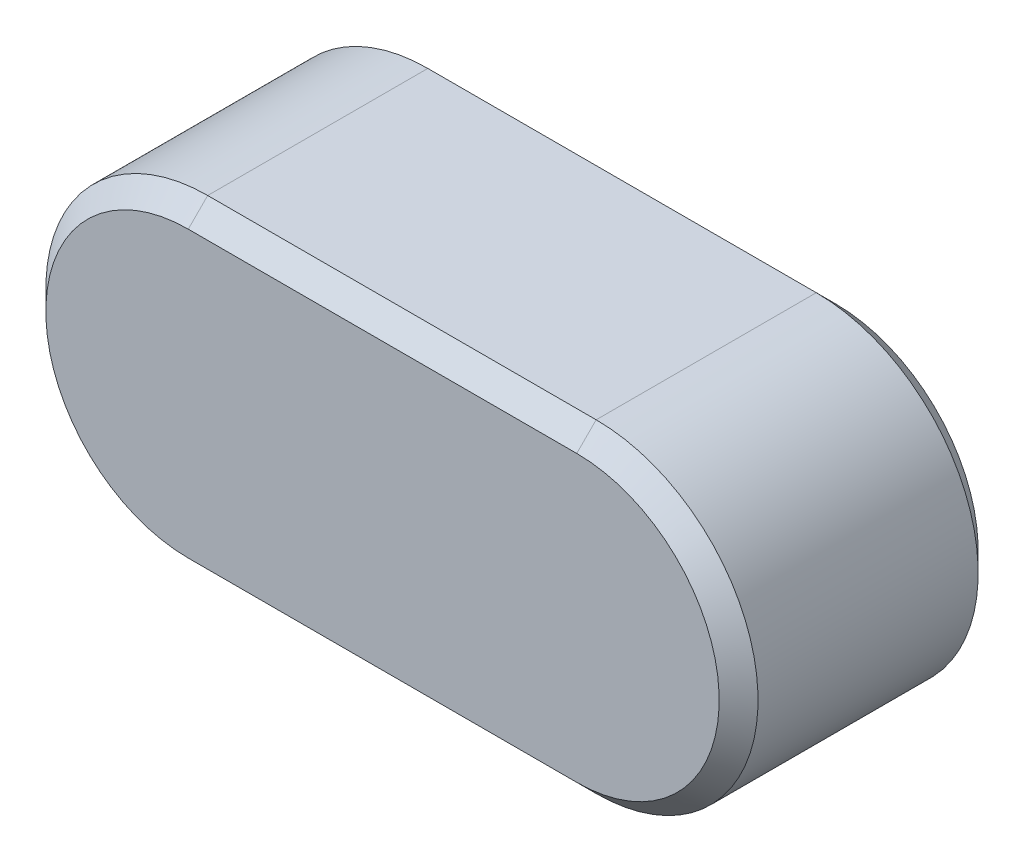
ISO-10303-21;
HEADER;
FILE_DESCRIPTION(('STEP AP214'),'2;1');
FILE_NAME('part.step','',(''),(''),'','','');
FILE_SCHEMA(('AUTOMOTIVE_DESIGN { 1 0 10303 214 1 1 1 1 }'));
ENDSEC;
DATA;
#1=APPLICATION_CONTEXT('core data for automotive mechanical design processes');
#2=APPLICATION_PROTOCOL_DEFINITION('international standard','automotive_design',2000,#1);
#3=PRODUCT_CONTEXT('',#1,'mechanical');
#4=PRODUCT('Part','Part','',(#3));
#5=PRODUCT_RELATED_PRODUCT_CATEGORY('part','',(#4));
#6=PRODUCT_DEFINITION_FORMATION('','',#4);
#7=PRODUCT_DEFINITION_CONTEXT('part definition',#1,'design');
#8=PRODUCT_DEFINITION('design','',#6,#7);
#9=PRODUCT_DEFINITION_SHAPE('','',#8);
#10=(LENGTH_UNIT() NAMED_UNIT(*) SI_UNIT(.MILLI.,.METRE.));
#11=(NAMED_UNIT(*) PLANE_ANGLE_UNIT() SI_UNIT($,.RADIAN.));
#12=(NAMED_UNIT(*) SI_UNIT($,.STERADIAN.) SOLID_ANGLE_UNIT());
#13=UNCERTAINTY_MEASURE_WITH_UNIT(LENGTH_MEASURE(1.E-05),#10,'distance_accuracy_value','');
#14=(GEOMETRIC_REPRESENTATION_CONTEXT(3) GLOBAL_UNCERTAINTY_ASSIGNED_CONTEXT((#13)) GLOBAL_UNIT_ASSIGNED_CONTEXT((#10,
#11,#12)) REPRESENTATION_CONTEXT('',''));
#15=CARTESIAN_POINT('',(0.,0.,0.));
#16=DIRECTION('',(0.,0.,1.));
#17=DIRECTION('',(1.,0.,0.));
#18=AXIS2_PLACEMENT_3D('',#15,#16,#17);
#19=CARTESIAN_POINT('',(-12.,0.,4.));
#20=DIRECTION('',(0.,0.,-1.));
#21=DIRECTION('',(-1.,0.,0.));
#22=AXIS2_PLACEMENT_3D('',#19,#20,#21);
#23=CYLINDRICAL_SURFACE('',#22,5.);
#24=DIRECTION('',(0.,0.,-1.));
#25=VECTOR('',#24,1.);
#26=CARTESIAN_POINT('',(-12.,-5.,4.));
#27=LINE('',#26,#25);
#28=CARTESIAN_POINT('',(-12.,-5.,3.4));
#29=VERTEX_POINT('',#28);
#30=CARTESIAN_POINT('',(-12.,-5.,-3.4));
#31=VERTEX_POINT('',#30);
#32=EDGE_CURVE('E133',#29,#31,#27,.T.);
#33=ORIENTED_EDGE('',*,*,#32,.F.);
#34=CARTESIAN_POINT('',(-12.,0.,3.4));
#35=DIRECTION('',(0.,0.,-1.));
#36=DIRECTION('',(-1.,0.,0.));
#37=AXIS2_PLACEMENT_3D('',#34,#35,#36);
#38=CIRCLE('',#37,5.);
#39=CARTESIAN_POINT('',(-12.,5.,3.4));
#40=VERTEX_POINT('',#39);
#41=EDGE_CURVE('E65',#29,#40,#38,.T.);
#42=ORIENTED_EDGE('',*,*,#41,.T.);
#43=DIRECTION('',(0.,0.,-1.));
#44=VECTOR('',#43,1.);
#45=CARTESIAN_POINT('',(-12.,5.,4.));
#46=LINE('',#45,#44);
#47=CARTESIAN_POINT('',(-12.,5.,-3.4));
#48=VERTEX_POINT('',#47);
#49=EDGE_CURVE('E185',#40,#48,#46,.T.);
#50=ORIENTED_EDGE('',*,*,#49,.T.);
#51=CARTESIAN_POINT('',(-12.,0.,-3.4));
#52=DIRECTION('',(0.,0.,-1.));
#53=DIRECTION('',(-1.,0.,0.));
#54=AXIS2_PLACEMENT_3D('',#51,#52,#53);
#55=CIRCLE('',#54,5.);
#56=EDGE_CURVE('E120',#48,#31,#55,.F.);
#57=ORIENTED_EDGE('',*,*,#56,.T.);
#58=EDGE_LOOP('',(#33,#42,#50,#57));
#59=FACE_BOUND('',#58,.T.);
#60=ADVANCED_FACE('F41',(#59),#23,.T.);
#61=CARTESIAN_POINT('',(0.,-5.,4.));
#62=DIRECTION('',(0.,1.,0.));
#63=DIRECTION('',(-1.,0.,0.));
#64=AXIS2_PLACEMENT_3D('',#61,#62,#63);
#65=PLANE('',#64);
#66=ORIENTED_EDGE('',*,*,#32,.T.);
#67=DIRECTION('',(1.,0.,0.));
#68=VECTOR('',#67,1.);
#69=CARTESIAN_POINT('',(0.,-5.,-3.4));
#70=LINE('',#69,#68);
#71=CARTESIAN_POINT('',(0.,-5.,-3.4));
#72=VERTEX_POINT('',#71);
#73=EDGE_CURVE('E131',#31,#72,#70,.T.);
#74=ORIENTED_EDGE('',*,*,#73,.T.);
#75=DIRECTION('',(0.,0.,-1.));
#76=VECTOR('',#75,1.);
#77=CARTESIAN_POINT('',(0.,-5.,4.));
#78=LINE('',#77,#76);
#79=CARTESIAN_POINT('',(0.,-5.,3.4));
#80=VERTEX_POINT('',#79);
#81=EDGE_CURVE('E113',#80,#72,#78,.T.);
#82=ORIENTED_EDGE('',*,*,#81,.F.);
#83=DIRECTION('',(-1.,0.,0.));
#84=VECTOR('',#83,1.);
#85=CARTESIAN_POINT('',(0.,-5.,3.4));
#86=LINE('',#85,#84);
#87=EDGE_CURVE('E129',#80,#29,#86,.T.);
#88=ORIENTED_EDGE('',*,*,#87,.T.);
#89=EDGE_LOOP('',(#66,#74,#82,#88));
#90=FACE_BOUND('',#89,.T.);
#91=ADVANCED_FACE('F128',(#90),#65,.F.);
#92=CARTESIAN_POINT('',(0.,0.,4.));
#93=DIRECTION('',(0.,0.,-1.));
#94=DIRECTION('',(-1.,0.,0.));
#95=AXIS2_PLACEMENT_3D('',#92,#93,#94);
#96=CYLINDRICAL_SURFACE('',#95,5.);
#97=DIRECTION('',(0.,0.,-1.));
#98=VECTOR('',#97,1.);
#99=CARTESIAN_POINT('',(0.,5.,4.));
#100=LINE('',#99,#98);
#101=CARTESIAN_POINT('',(0.,5.,3.4));
#102=VERTEX_POINT('',#101);
#103=CARTESIAN_POINT('',(0.,5.,-3.4));
#104=VERTEX_POINT('',#103);
#105=EDGE_CURVE('E114',#102,#104,#100,.T.);
#106=ORIENTED_EDGE('',*,*,#105,.F.);
#107=CARTESIAN_POINT('',(0.,0.,3.4));
#108=DIRECTION('',(0.,0.,-1.));
#109=DIRECTION('',(-1.,0.,0.));
#110=AXIS2_PLACEMENT_3D('',#107,#108,#109);
#111=CIRCLE('',#110,5.);
#112=EDGE_CURVE('E110',#102,#80,#111,.T.);
#113=ORIENTED_EDGE('',*,*,#112,.T.);
#114=ORIENTED_EDGE('',*,*,#81,.T.);
#115=CARTESIAN_POINT('',(0.,0.,-3.4));
#116=DIRECTION('',(0.,0.,-1.));
#117=DIRECTION('',(-1.,0.,0.));
#118=AXIS2_PLACEMENT_3D('',#115,#116,#117);
#119=CIRCLE('',#118,5.);
#120=EDGE_CURVE('E121',#72,#104,#119,.F.);
#121=ORIENTED_EDGE('',*,*,#120,.T.);
#122=EDGE_LOOP('',(#106,#113,#114,#121));
#123=FACE_BOUND('',#122,.T.);
#124=ADVANCED_FACE('F112',(#123),#96,.T.);
#125=CARTESIAN_POINT('',(-12.,5.,4.));
#126=DIRECTION('',(0.,-1.,0.));
#127=DIRECTION('',(0.,0.,-1.));
#128=AXIS2_PLACEMENT_3D('',#125,#126,#127);
#129=PLANE('',#128);
#130=ORIENTED_EDGE('',*,*,#49,.F.);
#131=DIRECTION('',(1.,0.,0.));
#132=VECTOR('',#131,1.);
#133=CARTESIAN_POINT('',(-12.,5.,3.4));
#134=LINE('',#133,#132);
#135=EDGE_CURVE('E11',#40,#102,#134,.T.);
#136=ORIENTED_EDGE('',*,*,#135,.T.);
#137=ORIENTED_EDGE('',*,*,#105,.T.);
#138=DIRECTION('',(-1.,0.,0.));
#139=VECTOR('',#138,1.);
#140=CARTESIAN_POINT('',(-12.,5.,-3.4));
#141=LINE('',#140,#139);
#142=EDGE_CURVE('E51',#104,#48,#141,.T.);
#143=ORIENTED_EDGE('',*,*,#142,.T.);
#144=EDGE_LOOP('',(#130,#136,#137,#143));
#145=FACE_BOUND('',#144,.T.);
#146=ADVANCED_FACE('F272',(#145),#129,.F.);
#147=CARTESIAN_POINT('',(-12.,0.,4.));
#148=DIRECTION('',(0.,0.,-1.));
#149=DIRECTION('',(-1.,0.,0.));
#150=AXIS2_PLACEMENT_3D('',#147,#148,#149);
#151=PLANE('',#150);
#152=CARTESIAN_POINT('',(-12.,0.,4.));
#153=DIRECTION('',(0.,0.,-1.));
#154=DIRECTION('',(-1.,0.,0.));
#155=AXIS2_PLACEMENT_3D('',#152,#153,#154);
#156=CIRCLE('',#155,4.4);
#157=CARTESIAN_POINT('',(-12.,4.4,4.));
#158=VERTEX_POINT('',#157);
#159=CARTESIAN_POINT('',(-12.,-4.4,4.));
#160=VERTEX_POINT('',#159);
#161=EDGE_CURVE('E217',#158,#160,#156,.F.);
#162=ORIENTED_EDGE('',*,*,#161,.T.);
#163=DIRECTION('',(1.,0.,0.));
#164=VECTOR('',#163,1.);
#165=CARTESIAN_POINT('',(-12.,-4.4,4.));
#166=LINE('',#165,#164);
#167=CARTESIAN_POINT('',(0.,-4.4,4.));
#168=VERTEX_POINT('',#167);
#169=EDGE_CURVE('E222',#160,#168,#166,.T.);
#170=ORIENTED_EDGE('',*,*,#169,.T.);
#171=CARTESIAN_POINT('',(0.,0.,4.));
#172=DIRECTION('',(0.,0.,-1.));
#173=DIRECTION('',(-1.,0.,0.));
#174=AXIS2_PLACEMENT_3D('',#171,#172,#173);
#175=CIRCLE('',#174,4.4);
#176=CARTESIAN_POINT('',(0.,4.4,4.));
#177=VERTEX_POINT('',#176);
#178=EDGE_CURVE('E145',#168,#177,#175,.F.);
#179=ORIENTED_EDGE('',*,*,#178,.T.);
#180=DIRECTION('',(-1.,0.,0.));
#181=VECTOR('',#180,1.);
#182=CARTESIAN_POINT('',(-12.,4.4,4.));
#183=LINE('',#182,#181);
#184=EDGE_CURVE('E214',#177,#158,#183,.T.);
#185=ORIENTED_EDGE('',*,*,#184,.T.);
#186=EDGE_LOOP('',(#162,#170,#179,#185));
#187=FACE_BOUND('',#186,.T.);
#188=ADVANCED_FACE('F275',(#187),#151,.F.);
#189=CARTESIAN_POINT('',(-12.,0.,-4.));
#190=DIRECTION('',(0.,0.,-1.));
#191=DIRECTION('',(-1.,0.,0.));
#192=AXIS2_PLACEMENT_3D('',#189,#190,#191);
#193=PLANE('',#192);
#194=CARTESIAN_POINT('',(0.,0.,-4.));
#195=DIRECTION('',(0.,0.,-1.));
#196=DIRECTION('',(-1.,0.,0.));
#197=AXIS2_PLACEMENT_3D('',#194,#195,#196);
#198=CIRCLE('',#197,4.4);
#199=CARTESIAN_POINT('',(0.,4.4,-4.));
#200=VERTEX_POINT('',#199);
#201=CARTESIAN_POINT('',(0.,-4.4,-4.));
#202=VERTEX_POINT('',#201);
#203=EDGE_CURVE('E207',#200,#202,#198,.T.);
#204=ORIENTED_EDGE('',*,*,#203,.T.);
#205=DIRECTION('',(-1.,0.,0.));
#206=VECTOR('',#205,1.);
#207=CARTESIAN_POINT('',(-12.,-4.4,-4.));
#208=LINE('',#207,#206);
#209=CARTESIAN_POINT('',(-12.,-4.4,-4.));
#210=VERTEX_POINT('',#209);
#211=EDGE_CURVE('E210',#202,#210,#208,.T.);
#212=ORIENTED_EDGE('',*,*,#211,.T.);
#213=CARTESIAN_POINT('',(-12.,0.,-4.));
#214=DIRECTION('',(0.,0.,-1.));
#215=DIRECTION('',(-1.,0.,0.));
#216=AXIS2_PLACEMENT_3D('',#213,#214,#215);
#217=CIRCLE('',#216,4.4);
#218=CARTESIAN_POINT('',(-12.,4.4,-4.));
#219=VERTEX_POINT('',#218);
#220=EDGE_CURVE('E204',#210,#219,#217,.T.);
#221=ORIENTED_EDGE('',*,*,#220,.T.);
#222=DIRECTION('',(1.,0.,0.));
#223=VECTOR('',#222,1.);
#224=CARTESIAN_POINT('',(0.,4.4,-4.));
#225=LINE('',#224,#223);
#226=EDGE_CURVE('E201',#219,#200,#225,.T.);
#227=ORIENTED_EDGE('',*,*,#226,.T.);
#228=EDGE_LOOP('',(#204,#212,#221,#227));
#229=FACE_BOUND('',#228,.T.);
#230=ADVANCED_FACE('F276',(#229),#193,.T.);
#231=CARTESIAN_POINT('',(-12.,5.,-3.4));
#232=DIRECTION('',(0.,0.707106781186547,-0.707106781186547));
#233=DIRECTION('',(0.,0.707106781186548,0.707106781186548));
#234=AXIS2_PLACEMENT_3D('',#231,#232,#233);
#235=PLANE('',#234);
#236=DIRECTION('',(0.,0.707106781186547,0.707106781186547));
#237=VECTOR('',#236,1.);
#238=CARTESIAN_POINT('',(0.,4.4,-4.));
#239=LINE('',#238,#237);
#240=EDGE_CURVE('E174',#200,#104,#239,.T.);
#241=ORIENTED_EDGE('',*,*,#240,.F.);
#242=ORIENTED_EDGE('',*,*,#226,.F.);
#243=DIRECTION('',(0.,-0.707106781186547,-0.707106781186547));
#244=VECTOR('',#243,1.);
#245=CARTESIAN_POINT('',(-12.,5.,-3.4));
#246=LINE('',#245,#244);
#247=EDGE_CURVE('E154',#48,#219,#246,.T.);
#248=ORIENTED_EDGE('',*,*,#247,.F.);
#249=ORIENTED_EDGE('',*,*,#142,.F.);
#250=EDGE_LOOP('',(#241,#242,#248,#249));
#251=FACE_BOUND('',#250,.T.);
#252=ADVANCED_FACE('F279',(#251),#235,.T.);
#253=CARTESIAN_POINT('',(-12.,0.,-3.4));
#254=DIRECTION('',(0.,0.,1.));
#255=DIRECTION('',(1.,0.,0.));
#256=AXIS2_PLACEMENT_3D('',#253,#254,#255);
#257=CONICAL_SURFACE('',#256,5.,0.785398163397448);
#258=ORIENTED_EDGE('',*,*,#247,.T.);
#259=ORIENTED_EDGE('',*,*,#220,.F.);
#260=DIRECTION('',(0.,0.707106781186547,-0.707106781186547));
#261=VECTOR('',#260,1.);
#262=CARTESIAN_POINT('',(-12.,-5.,-3.4));
#263=LINE('',#262,#261);
#264=EDGE_CURVE('E166',#31,#210,#263,.T.);
#265=ORIENTED_EDGE('',*,*,#264,.F.);
#266=ORIENTED_EDGE('',*,*,#56,.F.);
#267=EDGE_LOOP('',(#258,#259,#265,#266));
#268=FACE_BOUND('',#267,.T.);
#269=ADVANCED_FACE('F251',(#268),#257,.T.);
#270=CARTESIAN_POINT('',(0.,0.,-3.4));
#271=DIRECTION('',(0.,0.,1.));
#272=DIRECTION('',(1.,0.,0.));
#273=AXIS2_PLACEMENT_3D('',#270,#271,#272);
#274=CONICAL_SURFACE('',#273,5.,0.785398163397448);
#275=ORIENTED_EDGE('',*,*,#240,.T.);
#276=ORIENTED_EDGE('',*,*,#120,.F.);
#277=DIRECTION('',(0.,-0.707106781186547,0.707106781186547));
#278=VECTOR('',#277,1.);
#279=CARTESIAN_POINT('',(0.,-4.4,-4.));
#280=LINE('',#279,#278);
#281=EDGE_CURVE('E160',#202,#72,#280,.T.);
#282=ORIENTED_EDGE('',*,*,#281,.F.);
#283=ORIENTED_EDGE('',*,*,#203,.F.);
#284=EDGE_LOOP('',(#275,#276,#282,#283));
#285=FACE_BOUND('',#284,.T.);
#286=ADVANCED_FACE('F254',(#285),#274,.T.);
#287=CARTESIAN_POINT('',(0.,-5.,-3.4));
#288=DIRECTION('',(0.,-0.707106781186547,-0.707106781186547));
#289=DIRECTION('',(0.,0.707106781186548,-0.707106781186548));
#290=AXIS2_PLACEMENT_3D('',#287,#288,#289);
#291=PLANE('',#290);
#292=ORIENTED_EDGE('',*,*,#264,.T.);
#293=ORIENTED_EDGE('',*,*,#211,.F.);
#294=ORIENTED_EDGE('',*,*,#281,.T.);
#295=ORIENTED_EDGE('',*,*,#73,.F.);
#296=EDGE_LOOP('',(#292,#293,#294,#295));
#297=FACE_BOUND('',#296,.T.);
#298=ADVANCED_FACE('F252',(#297),#291,.T.);
#299=CARTESIAN_POINT('',(-12.,4.4,4.));
#300=DIRECTION('',(0.,-0.707106781186547,-0.707106781186547));
#301=DIRECTION('',(0.,0.707106781186548,-0.707106781186548));
#302=AXIS2_PLACEMENT_3D('',#299,#300,#301);
#303=PLANE('',#302);
#304=DIRECTION('',(0.,-0.707106781186547,0.707106781186547));
#305=VECTOR('',#304,1.);
#306=CARTESIAN_POINT('',(0.,5.,3.4));
#307=LINE('',#306,#305);
#308=EDGE_CURVE('E151',#102,#177,#307,.T.);
#309=ORIENTED_EDGE('',*,*,#308,.F.);
#310=ORIENTED_EDGE('',*,*,#135,.F.);
#311=DIRECTION('',(0.,0.707106781186547,-0.707106781186547));
#312=VECTOR('',#311,1.);
#313=CARTESIAN_POINT('',(-12.,4.4,4.));
#314=LINE('',#313,#312);
#315=EDGE_CURVE('E45',#158,#40,#314,.T.);
#316=ORIENTED_EDGE('',*,*,#315,.F.);
#317=ORIENTED_EDGE('',*,*,#184,.F.);
#318=EDGE_LOOP('',(#309,#310,#316,#317));
#319=FACE_BOUND('',#318,.T.);
#320=ADVANCED_FACE('F43',(#319),#303,.F.);
#321=CARTESIAN_POINT('',(-12.,0.,4.));
#322=DIRECTION('',(0.,0.,-1.));
#323=DIRECTION('',(-1.,0.,0.));
#324=AXIS2_PLACEMENT_3D('',#321,#322,#323);
#325=CONICAL_SURFACE('',#324,4.4,0.785398163397448);
#326=ORIENTED_EDGE('',*,*,#315,.T.);
#327=ORIENTED_EDGE('',*,*,#41,.F.);
#328=DIRECTION('',(0.,-0.707106781186547,-0.707106781186547));
#329=VECTOR('',#328,1.);
#330=CARTESIAN_POINT('',(-12.,-4.4,4.));
#331=LINE('',#330,#329);
#332=EDGE_CURVE('E141',#160,#29,#331,.T.);
#333=ORIENTED_EDGE('',*,*,#332,.F.);
#334=ORIENTED_EDGE('',*,*,#161,.F.);
#335=EDGE_LOOP('',(#326,#327,#333,#334));
#336=FACE_BOUND('',#335,.T.);
#337=ADVANCED_FACE('F260',(#336),#325,.T.);
#338=CARTESIAN_POINT('',(0.,0.,4.));
#339=DIRECTION('',(0.,0.,-1.));
#340=DIRECTION('',(-1.,0.,0.));
#341=AXIS2_PLACEMENT_3D('',#338,#339,#340);
#342=CONICAL_SURFACE('',#341,4.4,0.785398163397448);
#343=ORIENTED_EDGE('',*,*,#308,.T.);
#344=ORIENTED_EDGE('',*,*,#178,.F.);
#345=DIRECTION('',(0.,0.707106781186547,0.707106781186547));
#346=VECTOR('',#345,1.);
#347=CARTESIAN_POINT('',(0.,-5.,3.4));
#348=LINE('',#347,#346);
#349=EDGE_CURVE('E138',#80,#168,#348,.T.);
#350=ORIENTED_EDGE('',*,*,#349,.F.);
#351=ORIENTED_EDGE('',*,*,#112,.F.);
#352=EDGE_LOOP('',(#343,#344,#350,#351));
#353=FACE_BOUND('',#352,.T.);
#354=ADVANCED_FACE('F144',(#353),#342,.T.);
#355=CARTESIAN_POINT('',(-12.,-4.4,4.));
#356=DIRECTION('',(0.,0.707106781186547,-0.707106781186547));
#357=DIRECTION('',(0.,0.707106781186548,0.707106781186548));
#358=AXIS2_PLACEMENT_3D('',#355,#356,#357);
#359=PLANE('',#358);
#360=ORIENTED_EDGE('',*,*,#332,.T.);
#361=ORIENTED_EDGE('',*,*,#87,.F.);
#362=ORIENTED_EDGE('',*,*,#349,.T.);
#363=ORIENTED_EDGE('',*,*,#169,.F.);
#364=EDGE_LOOP('',(#360,#361,#362,#363));
#365=FACE_BOUND('',#364,.T.);
#366=ADVANCED_FACE('F136',(#365),#359,.F.);
#367=CLOSED_SHELL('',(#60,#91,#124,#146,#188,#230,#252,#269,#286,#298,#320,#337,#354,#366));
#368=MANIFOLD_SOLID_BREP('B2',#367);
#369=ADVANCED_BREP_SHAPE_REPRESENTATION('',(#18,#368),#14);
#370=SHAPE_DEFINITION_REPRESENTATION(#9,#369);
ENDSEC;
END-ISO-10303-21;
